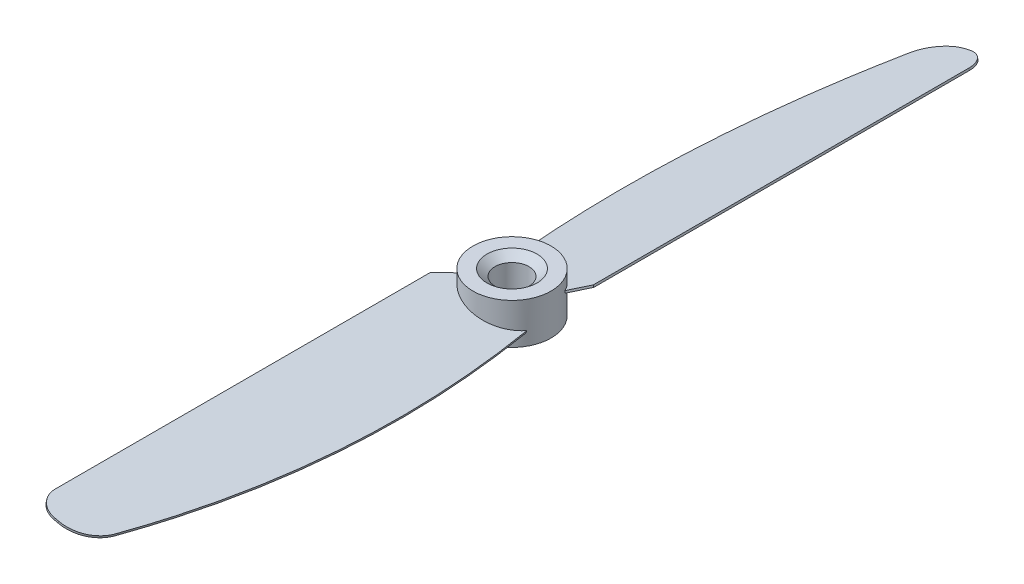
ISO-10303-21;
HEADER;
FILE_DESCRIPTION(('STEP AP214'),'2;1');
FILE_NAME('part.step','',(''),(''),'','','');
FILE_SCHEMA(('AUTOMOTIVE_DESIGN { 1 0 10303 214 1 1 1 1 }'));
ENDSEC;
DATA;
#1=APPLICATION_CONTEXT('core data for automotive mechanical design processes');
#2=APPLICATION_PROTOCOL_DEFINITION('international standard','automotive_design',2000,#1);
#3=PRODUCT_CONTEXT('',#1,'mechanical');
#4=PRODUCT('Part','Part','',(#3));
#5=PRODUCT_RELATED_PRODUCT_CATEGORY('part','',(#4));
#6=PRODUCT_DEFINITION_FORMATION('','',#4);
#7=PRODUCT_DEFINITION_CONTEXT('part definition',#1,'design');
#8=PRODUCT_DEFINITION('design','',#6,#7);
#9=PRODUCT_DEFINITION_SHAPE('','',#8);
#10=(LENGTH_UNIT() NAMED_UNIT(*) SI_UNIT(.MILLI.,.METRE.));
#11=(NAMED_UNIT(*) PLANE_ANGLE_UNIT() SI_UNIT($,.RADIAN.));
#12=(NAMED_UNIT(*) SI_UNIT($,.STERADIAN.) SOLID_ANGLE_UNIT());
#13=UNCERTAINTY_MEASURE_WITH_UNIT(LENGTH_MEASURE(1.E-05),#10,'distance_accuracy_value','');
#14=(GEOMETRIC_REPRESENTATION_CONTEXT(3) GLOBAL_UNCERTAINTY_ASSIGNED_CONTEXT((#13)) GLOBAL_UNIT_ASSIGNED_CONTEXT((#10,
#11,#12)) REPRESENTATION_CONTEXT('',''));
#15=CARTESIAN_POINT('',(0.,0.,0.));
#16=DIRECTION('',(0.,0.,1.));
#17=DIRECTION('',(1.,0.,0.));
#18=AXIS2_PLACEMENT_3D('',#15,#16,#17);
#19=CARTESIAN_POINT('',(0.,3.,0.));
#20=DIRECTION('',(0.,-1.,0.));
#21=DIRECTION('',(0.,0.,-1.));
#22=AXIS2_PLACEMENT_3D('',#19,#20,#21);
#23=CYLINDRICAL_SURFACE('',#22,5.75);
#24=CARTESIAN_POINT('',(0.,-3.,0.));
#25=DIRECTION('',(0.,1.,0.));
#26=DIRECTION('',(0.,0.,1.));
#27=AXIS2_PLACEMENT_3D('',#24,#25,#26);
#28=CIRCLE('',#27,5.75);
#29=CARTESIAN_POINT('',(0.,-3.,5.75));
#30=VERTEX_POINT('',#29);
#31=EDGE_CURVE('E393',#30,#30,#28,.T.);
#32=ORIENTED_EDGE('',*,*,#31,.T.);
#33=EDGE_LOOP('',(#32));
#34=FACE_BOUND('',#33,.T.);
#35=CARTESIAN_POINT('',(0.,3.,0.));
#36=DIRECTION('',(0.,1.,0.));
#37=DIRECTION('',(0.,0.,1.));
#38=AXIS2_PLACEMENT_3D('',#35,#36,#37);
#39=CIRCLE('',#38,5.75);
#40=CARTESIAN_POINT('',(0.,3.,5.75));
#41=VERTEX_POINT('',#40);
#42=EDGE_CURVE('E394',#41,#41,#39,.T.);
#43=ORIENTED_EDGE('',*,*,#42,.F.);
#44=EDGE_LOOP('',(#43));
#45=FACE_BOUND('',#44,.T.);
#46=CARTESIAN_POINT('',(4.95092888897266,-1.29695761315742,2.9241756336335));
#47=CARTESIAN_POINT('',(4.96004146965702,-1.24766608462987,2.90875047055603));
#48=CARTESIAN_POINT('',(4.96912570120887,-1.19840807526786,2.89320361840622));
#49=CARTESIAN_POINT('',(4.98723746604758,-1.09995909487493,2.86186653596193));
#50=CARTESIAN_POINT('',(4.99626499933443,-1.050768123844,2.84607630566745));
#51=CARTESIAN_POINT('',(5.00526418348878,-1.00161067197861,2.83016438630063));
#52=B_SPLINE_CURVE_WITH_KNOTS('',3,(#46,#47,#48,#49,#50,#51),.UNSPECIFIED.,.F.,.F.,(4,2,4),(0.,
0.157337898322915,0.31467579664583),.UNSPECIFIED.);
#53=CARTESIAN_POINT('',(4.95092888897266,-1.29695761315742,2.9241756336335));
#54=VERTEX_POINT('',#53);
#55=CARTESIAN_POINT('',(5.00526418348878,-1.00161067197862,2.83016438630063));
#56=VERTEX_POINT('',#55);
#57=EDGE_CURVE('E301',#54,#56,#52,.T.);
#58=ORIENTED_EDGE('',*,*,#57,.F.);
#59=CARTESIAN_POINT('',(0.,-0.153945616169009,0.));
#60=DIRECTION('',(-0.224951054343866,-0.974370064785235,0.));
#61=DIRECTION('',(0.974370064785235,-0.224951054343866,0.));
#62=AXIS2_PLACEMENT_3D('',#59,#60,#61);
#63=ELLIPSE('',#62,5.901248619812,5.75);
#64=CARTESIAN_POINT('',(-5.06581289758622,1.01558944407727,2.72030139628849));
#65=VERTEX_POINT('',#64);
#66=EDGE_CURVE('E311',#54,#65,#63,.T.);
#67=ORIENTED_EDGE('',*,*,#66,.T.);
#68=CARTESIAN_POINT('',(0.,13.9605805007826,0.));
#69=DIRECTION('',(0.781730290129931,-0.180476658030359,0.596930422578349));
#70=DIRECTION('',(-0.14343945106683,-0.983579267728937,-0.109530580074488));
#71=AXIS2_PLACEMENT_3D('',#68,#69,#70);
#72=ELLIPSE('',#71,31.8600757724179,5.75);
#73=CARTESIAN_POINT('',(-5.03688837867882,1.31680292505596,2.77349156492863));
#74=VERTEX_POINT('',#73);
#75=EDGE_CURVE('E312',#74,#65,#72,.T.);
#76=ORIENTED_EDGE('',*,*,#75,.F.);
#77=CARTESIAN_POINT('',(0.,0.153945616169009,0.));
#78=DIRECTION('',(-0.224951054343866,-0.974370064785235,0.));
#79=DIRECTION('',(0.974370064785235,-0.224951054343866,0.));
#80=AXIS2_PLACEMENT_3D('',#77,#78,#79);
#81=ELLIPSE('',#80,5.901248619812,5.75);
#82=EDGE_CURVE('E398',#56,#74,#81,.T.);
#83=ORIENTED_EDGE('',*,*,#82,.F.);
#84=EDGE_LOOP('',(#58,#67,#76,#83));
#85=FACE_BOUND('',#84,.T.);
#86=CARTESIAN_POINT('',(-4.95092888897266,-1.29695761315742,-2.9241756336335));
#87=CARTESIAN_POINT('',(-4.96004146965702,-1.24766608462987,-2.90875047055603));
#88=CARTESIAN_POINT('',(-4.96912570120887,-1.19840807526786,-2.89320361840622));
#89=CARTESIAN_POINT('',(-4.98723746604758,-1.09995909487493,-2.86186653596193));
#90=CARTESIAN_POINT('',(-4.99626499933443,-1.050768123844,-2.84607630566745));
#91=CARTESIAN_POINT('',(-5.00526418348878,-1.00161067197861,-2.83016438630063));
#92=B_SPLINE_CURVE_WITH_KNOTS('',3,(#86,#87,#88,#89,#90,#91),.UNSPECIFIED.,.F.,.F.,(4,2,4),(0.,
0.157337898322915,0.31467579664583),.UNSPECIFIED.);
#93=CARTESIAN_POINT('',(-4.95092888897266,-1.29695761315742,-2.92417563363351));
#94=VERTEX_POINT('',#93);
#95=CARTESIAN_POINT('',(-5.00526418348878,-1.00161067197862,-2.83016438630063));
#96=VERTEX_POINT('',#95);
#97=EDGE_CURVE('E64',#94,#96,#92,.T.);
#98=ORIENTED_EDGE('',*,*,#97,.F.);
#99=CARTESIAN_POINT('',(0.,-0.153945616169009,0.));
#100=DIRECTION('',(0.224951054343866,-0.974370064785235,0.));
#101=DIRECTION('',(-0.974370064785235,-0.224951054343866,0.));
#102=AXIS2_PLACEMENT_3D('',#99,#100,#101);
#103=ELLIPSE('',#102,5.901248619812,5.75);
#104=CARTESIAN_POINT('',(5.06581289758622,1.01558944407728,-2.72030139628849));
#105=VERTEX_POINT('',#104);
#106=EDGE_CURVE('E68',#94,#105,#103,.T.);
#107=ORIENTED_EDGE('',*,*,#106,.T.);
#108=CARTESIAN_POINT('',(0.,13.9605805007826,0.));
#109=DIRECTION('',(-0.781730290129931,-0.180476658030359,-0.596930422578349));
#110=DIRECTION('',(0.14343945106683,-0.983579267728937,0.109530580074488));
#111=AXIS2_PLACEMENT_3D('',#108,#109,#110);
#112=ELLIPSE('',#111,31.8600757724179,5.75);
#113=CARTESIAN_POINT('',(5.03688837867882,1.31680292505596,-2.77349156492863));
#114=VERTEX_POINT('',#113);
#115=EDGE_CURVE('E145',#114,#105,#112,.T.);
#116=ORIENTED_EDGE('',*,*,#115,.F.);
#117=CARTESIAN_POINT('',(0.,0.153945616169009,0.));
#118=DIRECTION('',(0.224951054343866,-0.974370064785235,0.));
#119=DIRECTION('',(-0.974370064785235,-0.224951054343866,0.));
#120=AXIS2_PLACEMENT_3D('',#117,#118,#119);
#121=ELLIPSE('',#120,5.901248619812,5.75);
#122=EDGE_CURVE('E147',#96,#114,#121,.T.);
#123=ORIENTED_EDGE('',*,*,#122,.F.);
#124=EDGE_LOOP('',(#98,#107,#116,#123));
#125=FACE_BOUND('',#124,.T.);
#126=ADVANCED_FACE('F47',(#34,#45,#85,#125),#23,.T.);
#127=CARTESIAN_POINT('',(0.,3.,0.));
#128=DIRECTION('',(0.,1.,0.));
#129=DIRECTION('',(0.,0.,1.));
#130=AXIS2_PLACEMENT_3D('',#127,#128,#129);
#131=PLANE('',#130);
#132=CARTESIAN_POINT('',(0.,3.,0.));
#133=DIRECTION('',(0.,1.,0.));
#134=DIRECTION('',(0.,0.,1.));
#135=AXIS2_PLACEMENT_3D('',#132,#133,#134);
#136=CIRCLE('',#135,3.6917535925942);
#137=CARTESIAN_POINT('',(0.,3.,3.6917535925942));
#138=VERTEX_POINT('',#137);
#139=EDGE_CURVE('E11',#138,#138,#136,.F.);
#140=ORIENTED_EDGE('',*,*,#139,.T.);
#141=EDGE_LOOP('',(#140));
#142=FACE_BOUND('',#141,.T.);
#143=ORIENTED_EDGE('',*,*,#42,.T.);
#144=EDGE_LOOP('',(#143));
#145=FACE_BOUND('',#144,.T.);
#146=ADVANCED_FACE('F284',(#142,#145),#131,.T.);
#147=CARTESIAN_POINT('',(0.,-3.,0.));
#148=DIRECTION('',(0.,1.,0.));
#149=DIRECTION('',(0.,0.,1.));
#150=AXIS2_PLACEMENT_3D('',#147,#148,#149);
#151=PLANE('',#150);
#152=CARTESIAN_POINT('',(0.,-3.,0.));
#153=DIRECTION('',(0.,1.,0.));
#154=DIRECTION('',(0.,0.,1.));
#155=AXIS2_PLACEMENT_3D('',#152,#153,#154);
#156=CIRCLE('',#155,3.50000000000002);
#157=CARTESIAN_POINT('',(0.,-3.,3.50000000000002));
#158=VERTEX_POINT('',#157);
#159=EDGE_CURVE('E57',#158,#158,#156,.T.);
#160=ORIENTED_EDGE('',*,*,#159,.T.);
#161=EDGE_LOOP('',(#160));
#162=FACE_BOUND('',#161,.T.);
#163=ORIENTED_EDGE('',*,*,#31,.F.);
#164=EDGE_LOOP('',(#163));
#165=FACE_BOUND('',#164,.T.);
#166=ADVANCED_FACE('F291',(#162,#165),#151,.F.);
#167=CARTESIAN_POINT('',(4.6766433630377,-1.2336338099329,1.04602340671731));
#168=CARTESIAN_POINT('',(9.19862738160931,-2.27761608059923,30.6940152034687));
#169=CARTESIAN_POINT('',(1.47130441184867,-0.493623004327574,59.5253646933514));
#170=B_SPLINE_CURVE_WITH_KNOTS('',2,(#167,#168,#169),.UNSPECIFIED.,.F.,.F.,(3,3),(0.,1.),.UNSPECIFIED.);
#171=DIRECTION('',(0.224951054343866,0.974370064785235,0.));
#172=VECTOR('',#171,1.);
#173=SURFACE_OF_LINEAR_EXTRUSION('',#170,#172);
#174=CARTESIAN_POINT('',(1.47130441184867,-0.493623004327573,59.5253646933514));
#175=VERTEX_POINT('',#174);
#176=EDGE_CURVE('E234',#54,#175,#170,.T.);
#177=ORIENTED_EDGE('',*,*,#176,.F.);
#178=ORIENTED_EDGE('',*,*,#57,.T.);
#179=CARTESIAN_POINT('',(4.74412867934086,-0.941322790497325,1.04602340671731));
#180=CARTESIAN_POINT('',(9.26611269791247,-1.98530506116366,30.6940152034687));
#181=CARTESIAN_POINT('',(1.53878972815183,-0.201311984892003,59.5253646933514));
#182=B_SPLINE_CURVE_WITH_KNOTS('',2,(#179,#180,#181),.UNSPECIFIED.,.F.,.F.,(3,3),(0.,1.),.UNSPECIFIED.);
#183=CARTESIAN_POINT('',(1.53878972815183,-0.201311984892003,59.5253646933514));
#184=VERTEX_POINT('',#183);
#185=EDGE_CURVE('E233',#56,#184,#182,.T.);
#186=ORIENTED_EDGE('',*,*,#185,.T.);
#187=DIRECTION('',(0.224951054343866,0.974370064785235,0.));
#188=VECTOR('',#187,1.);
#189=CARTESIAN_POINT('',(1.47130441184867,-0.493623004327573,59.5253646933514));
#190=LINE('',#189,#188);
#191=EDGE_CURVE('E359',#175,#184,#190,.T.);
#192=ORIENTED_EDGE('',*,*,#191,.F.);
#193=EDGE_LOOP('',(#177,#178,#186,#192));
#194=FACE_BOUND('',#193,.T.);
#195=ADVANCED_FACE('F315',(#194),#173,.F.);
#196=CARTESIAN_POINT('',(-3.29700298339323,0.607227498742572,58.5));
#197=DIRECTION('',(0.224951054343866,0.974370064785235,0.));
#198=DIRECTION('',(-0.974370064785235,0.224951054343866,0.));
#199=AXIS2_PLACEMENT_3D('',#196,#197,#198);
#200=CYLINDRICAL_SURFACE('',#199,5.);
#201=CARTESIAN_POINT('',(-3.22951766709007,0.899538518178143,58.5));
#202=DIRECTION('',(-0.224951054343866,-0.974370064785235,0.));
#203=DIRECTION('',(0.974370064785235,-0.224951054343866,0.));
#204=AXIS2_PLACEMENT_3D('',#201,#202,#203);
#205=CIRCLE('',#204,5.);
#206=CARTESIAN_POINT('',(-3.22951766709006,0.899538518178142,63.5));
#207=VERTEX_POINT('',#206);
#208=EDGE_CURVE('E416',#184,#207,#205,.T.);
#209=ORIENTED_EDGE('',*,*,#208,.T.);
#210=DIRECTION('',(0.224951054343866,0.974370064785235,0.));
#211=VECTOR('',#210,1.);
#212=CARTESIAN_POINT('',(-3.29700298339322,0.607227498742572,63.5));
#213=LINE('',#212,#211);
#214=CARTESIAN_POINT('',(-3.29700298339322,0.607227498742572,63.5));
#215=VERTEX_POINT('',#214);
#216=EDGE_CURVE('E387',#215,#207,#213,.T.);
#217=ORIENTED_EDGE('',*,*,#216,.F.);
#218=CARTESIAN_POINT('',(-3.29700298339323,0.607227498742572,58.5));
#219=DIRECTION('',(-0.224951054343866,-0.974370064785235,0.));
#220=DIRECTION('',(0.974370064785235,-0.224951054343866,0.));
#221=AXIS2_PLACEMENT_3D('',#218,#219,#220);
#222=CIRCLE('',#221,5.);
#223=EDGE_CURVE('E361',#175,#215,#222,.T.);
#224=ORIENTED_EDGE('',*,*,#223,.F.);
#225=ORIENTED_EDGE('',*,*,#191,.T.);
#226=EDGE_LOOP('',(#209,#217,#224,#225));
#227=FACE_BOUND('',#226,.T.);
#228=ADVANCED_FACE('F319',(#227),#200,.T.);
#229=CARTESIAN_POINT('',(-3.93604677685991,0.754762383390243,63.5));
#230=DIRECTION('',(0.,0.,-1.));
#231=DIRECTION('',(-1.,0.,0.));
#232=AXIS2_PLACEMENT_3D('',#229,#230,#231);
#233=PLANE('',#232);
#234=DIRECTION('',(-0.974370064785235,0.224951054343865,0.));
#235=VECTOR('',#234,1.);
#236=CARTESIAN_POINT('',(-3.86856146055675,1.04707340282581,63.5));
#237=LINE('',#236,#235);
#238=CARTESIAN_POINT('',(-3.86856146055675,1.04707340282581,63.5));
#239=VERTEX_POINT('',#238);
#240=EDGE_CURVE('E422',#207,#239,#237,.T.);
#241=ORIENTED_EDGE('',*,*,#240,.T.);
#242=DIRECTION('',(0.224951054343866,0.974370064785235,0.));
#243=VECTOR('',#242,1.);
#244=CARTESIAN_POINT('',(-3.93604677685991,0.754762383390243,63.5));
#245=LINE('',#244,#243);
#246=CARTESIAN_POINT('',(-3.93604677685991,0.754762383390243,63.5));
#247=VERTEX_POINT('',#246);
#248=EDGE_CURVE('E383',#247,#239,#245,.T.);
#249=ORIENTED_EDGE('',*,*,#248,.F.);
#250=DIRECTION('',(-0.974370064785235,0.224951054343865,0.));
#251=VECTOR('',#250,1.);
#252=CARTESIAN_POINT('',(-3.93604677685991,0.754762383390243,63.5));
#253=LINE('',#252,#251);
#254=EDGE_CURVE('E365',#215,#247,#253,.T.);
#255=ORIENTED_EDGE('',*,*,#254,.F.);
#256=ORIENTED_EDGE('',*,*,#216,.T.);
#257=EDGE_LOOP('',(#241,#249,#255,#256));
#258=FACE_BOUND('',#257,.T.);
#259=ADVANCED_FACE('F323',(#258),#233,.F.);
#260=CARTESIAN_POINT('',(-3.93604677685993,0.754762383390248,60.5));
#261=DIRECTION('',(0.224951054343866,0.974370064785235,0.));
#262=DIRECTION('',(-0.974370064785235,0.224951054343866,0.));
#263=AXIS2_PLACEMENT_3D('',#260,#261,#262);
#264=CYLINDRICAL_SURFACE('',#263,3.);
#265=CARTESIAN_POINT('',(-3.86856146055677,1.04707340282582,60.5));
#266=DIRECTION('',(-0.224951054343866,-0.974370064785235,0.));
#267=DIRECTION('',(-0.974370064785235,0.224951054343866,0.));
#268=AXIS2_PLACEMENT_3D('',#265,#266,#267);
#269=CIRCLE('',#268,3.);
#270=CARTESIAN_POINT('',(-6.79167165491247,1.72192656585741,60.5));
#271=VERTEX_POINT('',#270);
#272=EDGE_CURVE('E372',#239,#271,#269,.T.);
#273=ORIENTED_EDGE('',*,*,#272,.T.);
#274=DIRECTION('',(0.224951054343866,0.974370064785235,0.));
#275=VECTOR('',#274,1.);
#276=CARTESIAN_POINT('',(-6.85915697121563,1.42961554642184,60.5));
#277=LINE('',#276,#275);
#278=CARTESIAN_POINT('',(-6.85915697121563,1.42961554642184,60.5));
#279=VERTEX_POINT('',#278);
#280=EDGE_CURVE('E379',#279,#271,#277,.T.);
#281=ORIENTED_EDGE('',*,*,#280,.F.);
#282=CARTESIAN_POINT('',(-3.93604677685993,0.754762383390248,60.5));
#283=DIRECTION('',(-0.224951054343866,-0.974370064785235,0.));
#284=DIRECTION('',(-0.974370064785235,0.224951054343866,0.));
#285=AXIS2_PLACEMENT_3D('',#282,#283,#284);
#286=CIRCLE('',#285,3.);
#287=EDGE_CURVE('E408',#247,#279,#286,.T.);
#288=ORIENTED_EDGE('',*,*,#287,.F.);
#289=ORIENTED_EDGE('',*,*,#248,.T.);
#290=EDGE_LOOP('',(#273,#281,#288,#289));
#291=FACE_BOUND('',#290,.T.);
#292=ADVANCED_FACE('F327',(#291),#264,.T.);
#293=CARTESIAN_POINT('',(-6.85915697121563,1.42961554642184,5.19401252645925));
#294=DIRECTION('',(0.974370064785235,-0.224951054343866,0.));
#295=DIRECTION('',(0.224951054343866,0.974370064785235,0.));
#296=AXIS2_PLACEMENT_3D('',#293,#294,#295);
#297=PLANE('',#296);
#298=DIRECTION('',(0.,0.,-1.));
#299=VECTOR('',#298,1.);
#300=CARTESIAN_POINT('',(-6.79167165491247,1.72192656585741,5.19401252645925));
#301=LINE('',#300,#299);
#302=CARTESIAN_POINT('',(-6.79167165491247,1.72192656585741,5.19401252645925));
#303=VERTEX_POINT('',#302);
#304=EDGE_CURVE('E367',#271,#303,#301,.T.);
#305=ORIENTED_EDGE('',*,*,#304,.T.);
#306=DIRECTION('',(0.224951054343866,0.974370064785235,0.));
#307=VECTOR('',#306,1.);
#308=CARTESIAN_POINT('',(-6.85915697121563,1.42961554642184,5.19401252645925));
#309=LINE('',#308,#307);
#310=CARTESIAN_POINT('',(-6.85915697121563,1.42961554642184,5.19401252645925));
#311=VERTEX_POINT('',#310);
#312=EDGE_CURVE('E376',#311,#303,#309,.T.);
#313=ORIENTED_EDGE('',*,*,#312,.F.);
#314=DIRECTION('',(0.,0.,-1.));
#315=VECTOR('',#314,1.);
#316=CARTESIAN_POINT('',(-6.85915697121563,1.42961554642184,5.19401252645925));
#317=LINE('',#316,#315);
#318=EDGE_CURVE('E405',#279,#311,#317,.T.);
#319=ORIENTED_EDGE('',*,*,#318,.F.);
#320=ORIENTED_EDGE('',*,*,#280,.T.);
#321=EDGE_LOOP('',(#305,#313,#319,#320));
#322=FACE_BOUND('',#321,.T.);
#323=ADVANCED_FACE('F331',(#322),#297,.F.);
#324=CARTESIAN_POINT('',(-4.51032055912599,0.88734393271285,1.95406384010517));
#325=DIRECTION('',(0.781730290129931,-0.180476658030359,0.596930422578349));
#326=DIRECTION('',(0.606896100968708,0.,-0.794781179085778));
#327=AXIS2_PLACEMENT_3D('',#324,#325,#326);
#328=PLANE('',#327);
#329=DIRECTION('',(0.581631134519944,-0.134280127928929,-0.802293007946868));
#330=VECTOR('',#329,1.);
#331=CARTESIAN_POINT('',(-4.44283524282283,1.17965495214842,1.95406384010517));
#332=LINE('',#331,#330);
#333=EDGE_CURVE('E362',#303,#74,#332,.T.);
#334=ORIENTED_EDGE('',*,*,#333,.T.);
#335=ORIENTED_EDGE('',*,*,#75,.T.);
#336=DIRECTION('',(0.581631134519944,-0.134280127928929,-0.802293007946868));
#337=VECTOR('',#336,1.);
#338=CARTESIAN_POINT('',(-4.51032055912599,0.88734393271285,1.95406384010517));
#339=LINE('',#338,#337);
#340=EDGE_CURVE('E351',#311,#65,#339,.T.);
#341=ORIENTED_EDGE('',*,*,#340,.F.);
#342=ORIENTED_EDGE('',*,*,#312,.T.);
#343=EDGE_LOOP('',(#334,#335,#341,#342));
#344=FACE_BOUND('',#343,.T.);
#345=ADVANCED_FACE('F335',(#344),#328,.F.);
#346=CARTESIAN_POINT('',(6.13630063452625,-1.57062224386473,30.4898546267515));
#347=DIRECTION('',(-0.224951054343866,-0.974370064785235,0.));
#348=DIRECTION('',(0.974370064785235,-0.224951054343866,0.));
#349=AXIS2_PLACEMENT_3D('',#346,#347,#348);
#350=PLANE('',#349);
#351=ORIENTED_EDGE('',*,*,#66,.F.);
#352=ORIENTED_EDGE('',*,*,#176,.T.);
#353=ORIENTED_EDGE('',*,*,#223,.T.);
#354=ORIENTED_EDGE('',*,*,#254,.T.);
#355=ORIENTED_EDGE('',*,*,#287,.T.);
#356=ORIENTED_EDGE('',*,*,#318,.T.);
#357=ORIENTED_EDGE('',*,*,#340,.T.);
#358=EDGE_LOOP('',(#351,#352,#353,#354,#355,#356,#357));
#359=FACE_BOUND('',#358,.T.);
#360=ADVANCED_FACE('F339',(#359),#350,.T.);
#361=CARTESIAN_POINT('',(6.20378595082941,-1.27831122442916,30.4898546267515));
#362=DIRECTION('',(-0.224951054343866,-0.974370064785235,0.));
#363=DIRECTION('',(0.974370064785235,-0.224951054343866,0.));
#364=AXIS2_PLACEMENT_3D('',#361,#362,#363);
#365=PLANE('',#364);
#366=ORIENTED_EDGE('',*,*,#185,.F.);
#367=ORIENTED_EDGE('',*,*,#82,.T.);
#368=ORIENTED_EDGE('',*,*,#333,.F.);
#369=ORIENTED_EDGE('',*,*,#304,.F.);
#370=ORIENTED_EDGE('',*,*,#272,.F.);
#371=ORIENTED_EDGE('',*,*,#240,.F.);
#372=ORIENTED_EDGE('',*,*,#208,.F.);
#373=EDGE_LOOP('',(#366,#367,#368,#369,#370,#371,#372));
#374=FACE_BOUND('',#373,.T.);
#375=ADVANCED_FACE('F247',(#374),#365,.F.);
#376=CARTESIAN_POINT('',(-4.6766433630377,-1.2336338099329,-1.04602340671731));
#377=CARTESIAN_POINT('',(-9.19862738160931,-2.27761608059923,-30.6940152034687));
#378=CARTESIAN_POINT('',(-1.47130441184867,-0.493623004327574,-59.5253646933514));
#379=B_SPLINE_CURVE_WITH_KNOTS('',2,(#376,#377,#378),.UNSPECIFIED.,.F.,.F.,(3,3),(0.,1.),.UNSPECIFIED.);
#380=DIRECTION('',(-0.224951054343866,0.974370064785235,0.));
#381=VECTOR('',#380,1.);
#382=SURFACE_OF_LINEAR_EXTRUSION('',#379,#381);
#383=CARTESIAN_POINT('',(-1.47130441184867,-0.493623004327573,-59.5253646933514));
#384=VERTEX_POINT('',#383);
#385=EDGE_CURVE('E195',#94,#384,#379,.T.);
#386=ORIENTED_EDGE('',*,*,#385,.F.);
#387=ORIENTED_EDGE('',*,*,#97,.T.);
#388=CARTESIAN_POINT('',(-4.74412867934086,-0.941322790497325,-1.04602340671731));
#389=CARTESIAN_POINT('',(-9.26611269791247,-1.98530506116366,-30.6940152034687));
#390=CARTESIAN_POINT('',(-1.53878972815183,-0.201311984892003,-59.5253646933514));
#391=B_SPLINE_CURVE_WITH_KNOTS('',2,(#388,#389,#390),.UNSPECIFIED.,.F.,.F.,(3,3),(0.,1.),.UNSPECIFIED.);
#392=CARTESIAN_POINT('',(-1.53878972815183,-0.201311984892003,-59.5253646933514));
#393=VERTEX_POINT('',#392);
#394=EDGE_CURVE('E161',#96,#393,#391,.T.);
#395=ORIENTED_EDGE('',*,*,#394,.T.);
#396=DIRECTION('',(-0.224951054343866,0.974370064785235,0.));
#397=VECTOR('',#396,1.);
#398=CARTESIAN_POINT('',(-1.47130441184867,-0.493623004327573,-59.5253646933514));
#399=LINE('',#398,#397);
#400=EDGE_CURVE('E221',#384,#393,#399,.T.);
#401=ORIENTED_EDGE('',*,*,#400,.F.);
#402=EDGE_LOOP('',(#386,#387,#395,#401));
#403=FACE_BOUND('',#402,.T.);
#404=ADVANCED_FACE('F241',(#403),#382,.F.);
#405=CARTESIAN_POINT('',(3.29700298339323,0.607227498742572,-58.5));
#406=DIRECTION('',(-0.224951054343866,0.974370064785235,0.));
#407=DIRECTION('',(0.974370064785235,0.224951054343866,0.));
#408=AXIS2_PLACEMENT_3D('',#405,#406,#407);
#409=CYLINDRICAL_SURFACE('',#408,5.);
#410=CARTESIAN_POINT('',(3.22951766709007,0.899538518178143,-58.5));
#411=DIRECTION('',(0.224951054343866,-0.974370064785235,0.));
#412=DIRECTION('',(-0.974370064785235,-0.224951054343866,0.));
#413=AXIS2_PLACEMENT_3D('',#410,#411,#412);
#414=CIRCLE('',#413,5.);
#415=CARTESIAN_POINT('',(3.22951766709006,0.899538518178142,-63.5));
#416=VERTEX_POINT('',#415);
#417=EDGE_CURVE('E154',#393,#416,#414,.T.);
#418=ORIENTED_EDGE('',*,*,#417,.T.);
#419=DIRECTION('',(-0.224951054343866,0.974370064785235,0.));
#420=VECTOR('',#419,1.);
#421=CARTESIAN_POINT('',(3.29700298339322,0.607227498742572,-63.5));
#422=LINE('',#421,#420);
#423=CARTESIAN_POINT('',(3.29700298339322,0.607227498742572,-63.5));
#424=VERTEX_POINT('',#423);
#425=EDGE_CURVE('E217',#424,#416,#422,.T.);
#426=ORIENTED_EDGE('',*,*,#425,.F.);
#427=CARTESIAN_POINT('',(3.29700298339323,0.607227498742572,-58.5));
#428=DIRECTION('',(0.224951054343866,-0.974370064785235,0.));
#429=DIRECTION('',(-0.974370064785235,-0.224951054343866,0.));
#430=AXIS2_PLACEMENT_3D('',#427,#428,#429);
#431=CIRCLE('',#430,5.);
#432=EDGE_CURVE('E196',#384,#424,#431,.T.);
#433=ORIENTED_EDGE('',*,*,#432,.F.);
#434=ORIENTED_EDGE('',*,*,#400,.T.);
#435=EDGE_LOOP('',(#418,#426,#433,#434));
#436=FACE_BOUND('',#435,.T.);
#437=ADVANCED_FACE('F246',(#436),#409,.T.);
#438=CARTESIAN_POINT('',(3.93604677685991,0.754762383390243,-63.5));
#439=DIRECTION('',(0.,0.,1.));
#440=DIRECTION('',(1.,0.,0.));
#441=AXIS2_PLACEMENT_3D('',#438,#439,#440);
#442=PLANE('',#441);
#443=DIRECTION('',(0.974370064785235,0.224951054343865,0.));
#444=VECTOR('',#443,1.);
#445=CARTESIAN_POINT('',(3.86856146055675,1.04707340282581,-63.5));
#446=LINE('',#445,#444);
#447=CARTESIAN_POINT('',(3.86856146055675,1.04707340282581,-63.5));
#448=VERTEX_POINT('',#447);
#449=EDGE_CURVE('E182',#416,#448,#446,.T.);
#450=ORIENTED_EDGE('',*,*,#449,.T.);
#451=DIRECTION('',(-0.224951054343866,0.974370064785235,0.));
#452=VECTOR('',#451,1.);
#453=CARTESIAN_POINT('',(3.93604677685991,0.754762383390243,-63.5));
#454=LINE('',#453,#452);
#455=CARTESIAN_POINT('',(3.93604677685991,0.754762383390243,-63.5));
#456=VERTEX_POINT('',#455);
#457=EDGE_CURVE('E213',#456,#448,#454,.T.);
#458=ORIENTED_EDGE('',*,*,#457,.F.);
#459=DIRECTION('',(0.974370064785235,0.224951054343865,0.));
#460=VECTOR('',#459,1.);
#461=CARTESIAN_POINT('',(3.93604677685991,0.754762383390243,-63.5));
#462=LINE('',#461,#460);
#463=EDGE_CURVE('E199',#424,#456,#462,.T.);
#464=ORIENTED_EDGE('',*,*,#463,.F.);
#465=ORIENTED_EDGE('',*,*,#425,.T.);
#466=EDGE_LOOP('',(#450,#458,#464,#465));
#467=FACE_BOUND('',#466,.T.);
#468=ADVANCED_FACE('F266',(#467),#442,.F.);
#469=CARTESIAN_POINT('',(3.93604677685993,0.754762383390248,-60.5));
#470=DIRECTION('',(-0.224951054343866,0.974370064785235,0.));
#471=DIRECTION('',(0.974370064785235,0.224951054343866,0.));
#472=AXIS2_PLACEMENT_3D('',#469,#470,#471);
#473=CYLINDRICAL_SURFACE('',#472,3.);
#474=CARTESIAN_POINT('',(3.86856146055677,1.04707340282582,-60.5));
#475=DIRECTION('',(0.224951054343866,-0.974370064785235,0.));
#476=DIRECTION('',(0.974370064785235,0.224951054343866,0.));
#477=AXIS2_PLACEMENT_3D('',#474,#475,#476);
#478=CIRCLE('',#477,3.);
#479=CARTESIAN_POINT('',(6.79167165491247,1.72192656585741,-60.5));
#480=VERTEX_POINT('',#479);
#481=EDGE_CURVE('E173',#448,#480,#478,.T.);
#482=ORIENTED_EDGE('',*,*,#481,.T.);
#483=DIRECTION('',(-0.224951054343866,0.974370064785235,0.));
#484=VECTOR('',#483,1.);
#485=CARTESIAN_POINT('',(6.85915697121563,1.42961554642184,-60.5));
#486=LINE('',#485,#484);
#487=CARTESIAN_POINT('',(6.85915697121563,1.42961554642184,-60.5));
#488=VERTEX_POINT('',#487);
#489=EDGE_CURVE('E209',#488,#480,#486,.T.);
#490=ORIENTED_EDGE('',*,*,#489,.F.);
#491=CARTESIAN_POINT('',(3.93604677685993,0.754762383390248,-60.5));
#492=DIRECTION('',(0.224951054343866,-0.974370064785235,0.));
#493=DIRECTION('',(0.974370064785235,0.224951054343866,0.));
#494=AXIS2_PLACEMENT_3D('',#491,#492,#493);
#495=CIRCLE('',#494,3.);
#496=EDGE_CURVE('E202',#456,#488,#495,.T.);
#497=ORIENTED_EDGE('',*,*,#496,.F.);
#498=ORIENTED_EDGE('',*,*,#457,.T.);
#499=EDGE_LOOP('',(#482,#490,#497,#498));
#500=FACE_BOUND('',#499,.T.);
#501=ADVANCED_FACE('F272',(#500),#473,.T.);
#502=CARTESIAN_POINT('',(6.85915697121563,1.42961554642184,-5.19401252645925));
#503=DIRECTION('',(-0.974370064785235,-0.224951054343866,0.));
#504=DIRECTION('',(-0.224951054343866,0.974370064785235,0.));
#505=AXIS2_PLACEMENT_3D('',#502,#503,#504);
#506=PLANE('',#505);
#507=DIRECTION('',(0.,0.,1.));
#508=VECTOR('',#507,1.);
#509=CARTESIAN_POINT('',(6.79167165491247,1.72192656585741,-5.19401252645925));
#510=LINE('',#509,#508);
#511=CARTESIAN_POINT('',(6.79167165491247,1.72192656585741,-5.19401252645925));
#512=VERTEX_POINT('',#511);
#513=EDGE_CURVE('E169',#480,#512,#510,.T.);
#514=ORIENTED_EDGE('',*,*,#513,.T.);
#515=DIRECTION('',(-0.224951054343866,0.974370064785235,0.));
#516=VECTOR('',#515,1.);
#517=CARTESIAN_POINT('',(6.85915697121563,1.42961554642184,-5.19401252645925));
#518=LINE('',#517,#516);
#519=CARTESIAN_POINT('',(6.85915697121563,1.42961554642184,-5.19401252645925));
#520=VERTEX_POINT('',#519);
#521=EDGE_CURVE('E167',#520,#512,#518,.T.);
#522=ORIENTED_EDGE('',*,*,#521,.F.);
#523=DIRECTION('',(0.,0.,1.));
#524=VECTOR('',#523,1.);
#525=CARTESIAN_POINT('',(6.85915697121563,1.42961554642184,-5.19401252645925));
#526=LINE('',#525,#524);
#527=EDGE_CURVE('E205',#488,#520,#526,.T.);
#528=ORIENTED_EDGE('',*,*,#527,.F.);
#529=ORIENTED_EDGE('',*,*,#489,.T.);
#530=EDGE_LOOP('',(#514,#522,#528,#529));
#531=FACE_BOUND('',#530,.T.);
#532=ADVANCED_FACE('F274',(#531),#506,.F.);
#533=CARTESIAN_POINT('',(-6.13630063452625,-1.57062224386473,-30.4898546267515));
#534=DIRECTION('',(0.224951054343866,-0.974370064785235,0.));
#535=DIRECTION('',(-0.974370064785235,-0.224951054343866,0.));
#536=AXIS2_PLACEMENT_3D('',#533,#534,#535);
#537=PLANE('',#536);
#538=ORIENTED_EDGE('',*,*,#106,.F.);
#539=ORIENTED_EDGE('',*,*,#385,.T.);
#540=ORIENTED_EDGE('',*,*,#432,.T.);
#541=ORIENTED_EDGE('',*,*,#463,.T.);
#542=ORIENTED_EDGE('',*,*,#496,.T.);
#543=ORIENTED_EDGE('',*,*,#527,.T.);
#544=DIRECTION('',(-0.581631134519944,-0.134280127928929,0.802293007946868));
#545=VECTOR('',#544,1.);
#546=CARTESIAN_POINT('',(4.51032055912599,0.88734393271285,-1.95406384010517));
#547=LINE('',#546,#545);
#548=EDGE_CURVE('E153',#520,#105,#547,.T.);
#549=ORIENTED_EDGE('',*,*,#548,.T.);
#550=EDGE_LOOP('',(#538,#539,#540,#541,#542,#543,#549));
#551=FACE_BOUND('',#550,.T.);
#552=ADVANCED_FACE('F260',(#551),#537,.T.);
#553=CARTESIAN_POINT('',(4.51032055912599,0.88734393271285,-1.95406384010517));
#554=DIRECTION('',(-0.781730290129931,-0.180476658030359,-0.596930422578349));
#555=DIRECTION('',(-0.606896100968708,0.,0.794781179085778));
#556=AXIS2_PLACEMENT_3D('',#553,#554,#555);
#557=PLANE('',#556);
#558=DIRECTION('',(-0.581631134519944,-0.134280127928929,0.802293007946868));
#559=VECTOR('',#558,1.);
#560=CARTESIAN_POINT('',(4.44283524282283,1.17965495214842,-1.95406384010517));
#561=LINE('',#560,#559);
#562=EDGE_CURVE('E158',#512,#114,#561,.T.);
#563=ORIENTED_EDGE('',*,*,#562,.T.);
#564=ORIENTED_EDGE('',*,*,#115,.T.);
#565=ORIENTED_EDGE('',*,*,#548,.F.);
#566=ORIENTED_EDGE('',*,*,#521,.T.);
#567=EDGE_LOOP('',(#563,#564,#565,#566));
#568=FACE_BOUND('',#567,.T.);
#569=ADVANCED_FACE('F165',(#568),#557,.F.);
#570=CARTESIAN_POINT('',(-6.20378595082941,-1.27831122442916,-30.4898546267515));
#571=DIRECTION('',(0.224951054343866,-0.974370064785235,0.));
#572=DIRECTION('',(-0.974370064785235,-0.224951054343866,0.));
#573=AXIS2_PLACEMENT_3D('',#570,#571,#572);
#574=PLANE('',#573);
#575=ORIENTED_EDGE('',*,*,#394,.F.);
#576=ORIENTED_EDGE('',*,*,#122,.T.);
#577=ORIENTED_EDGE('',*,*,#562,.F.);
#578=ORIENTED_EDGE('',*,*,#513,.F.);
#579=ORIENTED_EDGE('',*,*,#481,.F.);
#580=ORIENTED_EDGE('',*,*,#449,.F.);
#581=ORIENTED_EDGE('',*,*,#417,.F.);
#582=EDGE_LOOP('',(#575,#576,#577,#578,#579,#580,#581));
#583=FACE_BOUND('',#582,.T.);
#584=ADVANCED_FACE('F157',(#583),#574,.F.);
#585=CARTESIAN_POINT('',(0.,3.,0.));
#586=DIRECTION('',(0.,-1.,0.));
#587=DIRECTION('',(0.,0.,-1.));
#588=AXIS2_PLACEMENT_3D('',#585,#586,#587);
#589=CYLINDRICAL_SURFACE('',#588,2.5);
#590=CARTESIAN_POINT('',(0.,-1.80824640740578,0.));
#591=DIRECTION('',(0.,1.,0.));
#592=DIRECTION('',(0.,0.,1.));
#593=AXIS2_PLACEMENT_3D('',#590,#591,#592);
#594=CIRCLE('',#593,2.5);
#595=CARTESIAN_POINT('',(0.,-1.80824640740578,2.5));
#596=VERTEX_POINT('',#595);
#597=EDGE_CURVE('E441',#596,#596,#594,.F.);
#598=ORIENTED_EDGE('',*,*,#597,.T.);
#599=EDGE_LOOP('',(#598));
#600=FACE_BOUND('',#599,.T.);
#601=CARTESIAN_POINT('',(0.,2.,0.));
#602=DIRECTION('',(0.,1.,0.));
#603=DIRECTION('',(0.,0.,1.));
#604=AXIS2_PLACEMENT_3D('',#601,#602,#603);
#605=CIRCLE('',#604,2.5);
#606=CARTESIAN_POINT('',(0.,2.,2.5));
#607=VERTEX_POINT('',#606);
#608=EDGE_CURVE('E355',#607,#607,#605,.T.);
#609=ORIENTED_EDGE('',*,*,#608,.T.);
#610=EDGE_LOOP('',(#609));
#611=FACE_BOUND('',#610,.T.);
#612=ADVANCED_FACE('F452',(#600,#611),#589,.F.);
#613=CARTESIAN_POINT('',(0.,-1.80824640740578,0.));
#614=DIRECTION('',(0.,-1.,0.));
#615=DIRECTION('',(0.,0.,-1.));
#616=AXIS2_PLACEMENT_3D('',#613,#614,#615);
#617=CONICAL_SURFACE('',#616,2.5,0.698131700797737);
#618=ORIENTED_EDGE('',*,*,#159,.F.);
#619=EDGE_LOOP('',(#618));
#620=FACE_BOUND('',#619,.T.);
#621=ORIENTED_EDGE('',*,*,#597,.F.);
#622=EDGE_LOOP('',(#621));
#623=FACE_BOUND('',#622,.T.);
#624=ADVANCED_FACE('F299',(#620,#623),#617,.F.);
#625=CARTESIAN_POINT('',(0.,3.,0.));
#626=DIRECTION('',(0.,1.,0.));
#627=DIRECTION('',(0.,0.,1.));
#628=AXIS2_PLACEMENT_3D('',#625,#626,#627);
#629=CONICAL_SURFACE('',#628,3.6917535925942,0.872664625997163);
#630=ORIENTED_EDGE('',*,*,#608,.F.);
#631=EDGE_LOOP('',(#630));
#632=FACE_BOUND('',#631,.T.);
#633=ORIENTED_EDGE('',*,*,#139,.F.);
#634=EDGE_LOOP('',(#633));
#635=FACE_BOUND('',#634,.T.);
#636=ADVANCED_FACE('F50',(#632,#635),#629,.F.);
#637=CLOSED_SHELL('',(#126,#146,#166,#195,#228,#259,#292,#323,#345,#360,#375,#404,#437,#468,
#501,#532,#552,#569,#584,#612,#624,#636));
#638=MANIFOLD_SOLID_BREP('B2',#637);
#639=ADVANCED_BREP_SHAPE_REPRESENTATION('',(#18,#638),#14);
#640=SHAPE_DEFINITION_REPRESENTATION(#9,#639);
ENDSEC;
END-ISO-10303-21;
